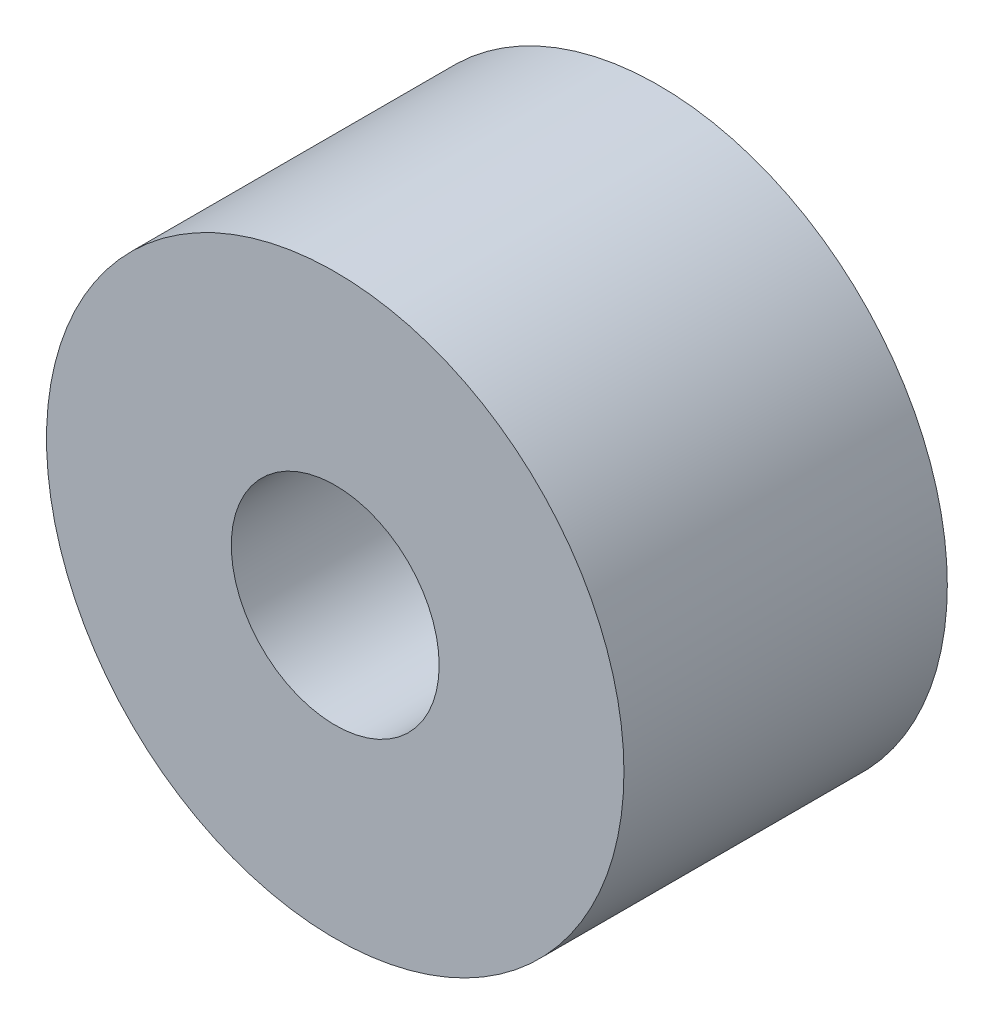
ISO-10303-21;
HEADER;
FILE_DESCRIPTION(('STEP AP214'),'2;1');
FILE_NAME('part.step','',(''),(''),'','','');
FILE_SCHEMA(('AUTOMOTIVE_DESIGN { 1 0 10303 214 1 1 1 1 }'));
ENDSEC;
DATA;
#1=APPLICATION_CONTEXT('core data for automotive mechanical design processes');
#2=APPLICATION_PROTOCOL_DEFINITION('international standard','automotive_design',2000,#1);
#3=PRODUCT_CONTEXT('',#1,'mechanical');
#4=PRODUCT('Part','Part','',(#3));
#5=PRODUCT_RELATED_PRODUCT_CATEGORY('part','',(#4));
#6=PRODUCT_DEFINITION_FORMATION('','',#4);
#7=PRODUCT_DEFINITION_CONTEXT('part definition',#1,'design');
#8=PRODUCT_DEFINITION('design','',#6,#7);
#9=PRODUCT_DEFINITION_SHAPE('','',#8);
#10=(LENGTH_UNIT() NAMED_UNIT(*) SI_UNIT(.MILLI.,.METRE.));
#11=(NAMED_UNIT(*) PLANE_ANGLE_UNIT() SI_UNIT($,.RADIAN.));
#12=(NAMED_UNIT(*) SI_UNIT($,.STERADIAN.) SOLID_ANGLE_UNIT());
#13=UNCERTAINTY_MEASURE_WITH_UNIT(LENGTH_MEASURE(1.E-05),#10,'distance_accuracy_value','');
#14=(GEOMETRIC_REPRESENTATION_CONTEXT(3) GLOBAL_UNCERTAINTY_ASSIGNED_CONTEXT((#13)) GLOBAL_UNIT_ASSIGNED_CONTEXT((#10,
#11,#12)) REPRESENTATION_CONTEXT('',''));
#15=CARTESIAN_POINT('',(0.,0.,0.));
#16=DIRECTION('',(0.,0.,1.));
#17=DIRECTION('',(1.,0.,0.));
#18=AXIS2_PLACEMENT_3D('',#15,#16,#17);
#19=CARTESIAN_POINT('',(0.,0.,14.));
#20=DIRECTION('',(0.,0.,1.));
#21=DIRECTION('',(1.,0.,0.));
#22=AXIS2_PLACEMENT_3D('',#19,#20,#21);
#23=PLANE('',#22);
#24=CARTESIAN_POINT('',(0.,0.,14.));
#25=DIRECTION('',(0.,0.,1.));
#26=DIRECTION('',(1.,0.,0.));
#27=AXIS2_PLACEMENT_3D('',#24,#25,#26);
#28=CIRCLE('',#27,12.5);
#29=CARTESIAN_POINT('',(12.5,0.,14.));
#30=VERTEX_POINT('',#29);
#31=EDGE_CURVE('E10',#30,#30,#28,.T.);
#32=ORIENTED_EDGE('',*,*,#31,.T.);
#33=EDGE_LOOP('',(#32));
#34=FACE_BOUND('',#33,.T.);
#35=CARTESIAN_POINT('',(0.,0.,14.));
#36=DIRECTION('',(0.,0.,1.));
#37=DIRECTION('',(1.,0.,0.));
#38=AXIS2_PLACEMENT_3D('',#35,#36,#37);
#39=CIRCLE('',#38,4.5);
#40=CARTESIAN_POINT('',(4.5,0.,14.));
#41=VERTEX_POINT('',#40);
#42=EDGE_CURVE('E44',#41,#41,#39,.T.);
#43=ORIENTED_EDGE('',*,*,#42,.F.);
#44=EDGE_LOOP('',(#43));
#45=FACE_BOUND('',#44,.T.);
#46=ADVANCED_FACE('F33',(#34,#45),#23,.T.);
#47=CARTESIAN_POINT('',(0.,0.,0.));
#48=DIRECTION('',(0.,0.,1.));
#49=DIRECTION('',(1.,0.,0.));
#50=AXIS2_PLACEMENT_3D('',#47,#48,#49);
#51=PLANE('',#50);
#52=CARTESIAN_POINT('',(0.,0.,0.));
#53=DIRECTION('',(0.,0.,1.));
#54=DIRECTION('',(1.,0.,0.));
#55=AXIS2_PLACEMENT_3D('',#52,#53,#54);
#56=CIRCLE('',#55,12.5);
#57=CARTESIAN_POINT('',(12.5,0.,0.));
#58=VERTEX_POINT('',#57);
#59=EDGE_CURVE('E37',#58,#58,#56,.T.);
#60=ORIENTED_EDGE('',*,*,#59,.F.);
#61=EDGE_LOOP('',(#60));
#62=FACE_BOUND('',#61,.T.);
#63=CARTESIAN_POINT('',(0.,0.,0.));
#64=DIRECTION('',(0.,0.,1.));
#65=DIRECTION('',(1.,0.,0.));
#66=AXIS2_PLACEMENT_3D('',#63,#64,#65);
#67=CIRCLE('',#66,4.5);
#68=CARTESIAN_POINT('',(4.5,0.,0.));
#69=VERTEX_POINT('',#68);
#70=EDGE_CURVE('E46',#69,#69,#67,.T.);
#71=ORIENTED_EDGE('',*,*,#70,.T.);
#72=EDGE_LOOP('',(#71));
#73=FACE_BOUND('',#72,.T.);
#74=ADVANCED_FACE('F56',(#62,#73),#51,.F.);
#75=CARTESIAN_POINT('',(0.,0.,14.));
#76=DIRECTION('',(0.,0.,-1.));
#77=DIRECTION('',(-1.,0.,0.));
#78=AXIS2_PLACEMENT_3D('',#75,#76,#77);
#79=CYLINDRICAL_SURFACE('',#78,12.5);
#80=ORIENTED_EDGE('',*,*,#31,.F.);
#81=EDGE_LOOP('',(#80));
#82=FACE_BOUND('',#81,.T.);
#83=ORIENTED_EDGE('',*,*,#59,.T.);
#84=EDGE_LOOP('',(#83));
#85=FACE_BOUND('',#84,.T.);
#86=ADVANCED_FACE('F35',(#82,#85),#79,.T.);
#87=CARTESIAN_POINT('',(0.,0.,14.));
#88=DIRECTION('',(0.,0.,-1.));
#89=DIRECTION('',(-1.,0.,0.));
#90=AXIS2_PLACEMENT_3D('',#87,#88,#89);
#91=CYLINDRICAL_SURFACE('',#90,4.5);
#92=ORIENTED_EDGE('',*,*,#42,.T.);
#93=EDGE_LOOP('',(#92));
#94=FACE_BOUND('',#93,.T.);
#95=ORIENTED_EDGE('',*,*,#70,.F.);
#96=EDGE_LOOP('',(#95));
#97=FACE_BOUND('',#96,.T.);
#98=ADVANCED_FACE('F52',(#94,#97),#91,.F.);
#99=CLOSED_SHELL('',(#46,#74,#86,#98));
#100=MANIFOLD_SOLID_BREP('B2',#99);
#101=ADVANCED_BREP_SHAPE_REPRESENTATION('',(#18,#100),#14);
#102=SHAPE_DEFINITION_REPRESENTATION(#9,#101);
ENDSEC;
END-ISO-10303-21;
